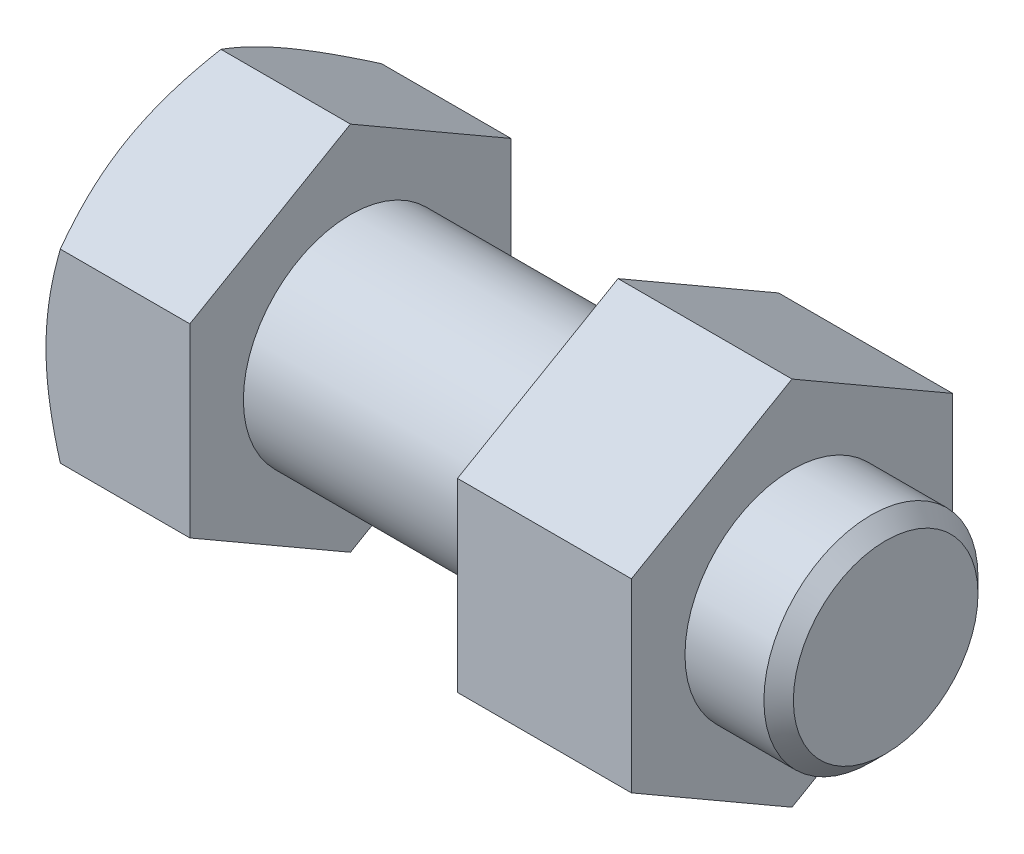
ISO-10303-21;
HEADER;
FILE_DESCRIPTION(('STEP AP214'),'2;1');
FILE_NAME('part.step','',(''),(''),'','','');
FILE_SCHEMA(('AUTOMOTIVE_DESIGN { 1 0 10303 214 1 1 1 1 }'));
ENDSEC;
DATA;
#1=APPLICATION_CONTEXT('core data for automotive mechanical design processes');
#2=APPLICATION_PROTOCOL_DEFINITION('international standard','automotive_design',2000,#1);
#3=PRODUCT_CONTEXT('',#1,'mechanical');
#4=PRODUCT('Part','Part','',(#3));
#5=PRODUCT_RELATED_PRODUCT_CATEGORY('part','',(#4));
#6=PRODUCT_DEFINITION_FORMATION('','',#4);
#7=PRODUCT_DEFINITION_CONTEXT('part definition',#1,'design');
#8=PRODUCT_DEFINITION('design','',#6,#7);
#9=PRODUCT_DEFINITION_SHAPE('','',#8);
#10=(LENGTH_UNIT() NAMED_UNIT(*) SI_UNIT(.MILLI.,.METRE.));
#11=(NAMED_UNIT(*) PLANE_ANGLE_UNIT() SI_UNIT($,.RADIAN.));
#12=(NAMED_UNIT(*) SI_UNIT($,.STERADIAN.) SOLID_ANGLE_UNIT());
#13=UNCERTAINTY_MEASURE_WITH_UNIT(LENGTH_MEASURE(1.E-05),#10,'distance_accuracy_value','');
#14=(GEOMETRIC_REPRESENTATION_CONTEXT(3) GLOBAL_UNCERTAINTY_ASSIGNED_CONTEXT((#13)) GLOBAL_UNIT_ASSIGNED_CONTEXT((#10,
#11,#12)) REPRESENTATION_CONTEXT('',''));
#15=CARTESIAN_POINT('',(0.,0.,0.));
#16=DIRECTION('',(0.,0.,1.));
#17=DIRECTION('',(1.,0.,0.));
#18=AXIS2_PLACEMENT_3D('',#15,#16,#17);
#19=CARTESIAN_POINT('',(0.,0.,0.));
#20=DIRECTION('',(-1.,0.,0.));
#21=DIRECTION('',(0.,0.,1.00000000000004));
#22=AXIS2_PLACEMENT_3D('',#19,#20,#21);
#23=CYLINDRICAL_SURFACE('',#22,8.);
#24=CARTESIAN_POINT('',(10.75,-3.33066907387547E-13,1.49880108324396E-12));
#25=DIRECTION('',(1.,0.,0.));
#26=DIRECTION('',(0.,0.,-1.00000000000004));
#27=AXIS2_PLACEMENT_3D('',#24,#25,#26);
#28=CIRCLE('',#27,8.);
#29=CARTESIAN_POINT('',(10.75,-5.39124300757976E-13,-7.99999999999882));
#30=VERTEX_POINT('',#29);
#31=EDGE_CURVE('E276',#30,#30,#28,.F.);
#32=ORIENTED_EDGE('',*,*,#31,.F.);
#33=EDGE_LOOP('',(#32));
#34=FACE_BOUND('',#33,.T.);
#35=CARTESIAN_POINT('',(30.7500000000001,-6.93889390390723E-13,2.13717932240343E-12));
#36=DIRECTION('',(1.,0.,0.));
#37=DIRECTION('',(0.,0.,-1.00000000000004));
#38=AXIS2_PLACEMENT_3D('',#35,#36,#37);
#39=CIRCLE('',#38,8.);
#40=CARTESIAN_POINT('',(30.7500000000001,-8.99946783761152E-13,-7.99999999999819));
#41=VERTEX_POINT('',#40);
#42=EDGE_CURVE('E11',#41,#41,#39,.T.);
#43=ORIENTED_EDGE('',*,*,#42,.F.);
#44=EDGE_LOOP('',(#43));
#45=FACE_BOUND('',#44,.T.);
#46=ADVANCED_FACE('F34',(#34,#45),#23,.T.);
#47=CARTESIAN_POINT('',(10.75,6.92820323027521,-11.9999999999988));
#48=DIRECTION('',(0.,-0.866025403784438,0.500000000000001));
#49=DIRECTION('',(0.,-0.500000000000034,-0.866025403784486));
#50=AXIS2_PLACEMENT_3D('',#47,#48,#49);
#51=PLANE('',#50);
#52=CARTESIAN_POINT('',(1.07186343722443,13.8565219306047,0.000200000002364975));
#53=CARTESIAN_POINT('',(0.983949632185894,13.7042251307134,-0.263585795240103));
#54=CARTESIAN_POINT('',(0.900025997556726,13.5513604901484,-0.52835511937974));
#55=CARTESIAN_POINT('',(0.741266218872873,13.2444053507122,-1.06001701652775));
#56=CARTESIAN_POINT('',(0.666433063673565,13.0903144663125,-1.3269102572912));
#57=CARTESIAN_POINT('',(0.457017539853894,12.6255589607761,-2.13189040597759));
#58=CARTESIAN_POINT('',(0.337903236722407,12.3130596590921,-2.67315507382412));
#59=CARTESIAN_POINT('',(0.198231061002743,11.8454187840145,-3.48313282915447));
#60=CARTESIAN_POINT('',(0.158443797040114,11.6916742921308,-3.74942610048088));
#61=CARTESIAN_POINT('',(0.0917233692164842,11.3834734611374,-4.28324559869649));
#62=CARTESIAN_POINT('',(0.0647904527668233,11.229017108384,-4.55077184921715));
#63=CARTESIAN_POINT('',(0.0244685919168984,10.919846895381,-5.08627036632515));
#64=CARTESIAN_POINT('',(0.0110635528835544,10.7651335610073,-5.35424172206845));
#65=CARTESIAN_POINT('',(-0.00191690624503581,10.4555635369285,-5.89043273227393));
#66=CARTESIAN_POINT('',(-0.00149275364417565,10.3007068518007,-6.15865237880818));
#67=CARTESIAN_POINT('',(0.0122200193365649,10.011202064883,-6.6600893787839));
#68=CARTESIAN_POINT('',(0.0238359825764981,9.8765333164982,-6.89334249317705));
#69=CARTESIAN_POINT('',(0.0573080088733852,9.60750555673675,-7.35931224172962));
#70=CARTESIAN_POINT('',(0.0791647962660929,9.47314656794506,-7.59202883677067));
#71=CARTESIAN_POINT('',(0.132737416541935,9.20481134519063,-8.05679907604184));
#72=CARTESIAN_POINT('',(0.164461392492234,9.07083551994057,-8.28885201236084));
#73=CARTESIAN_POINT('',(0.237211775669958,8.80351197901461,-8.75186996730376));
#74=CARTESIAN_POINT('',(0.27823881518264,8.67016430666039,-8.98283491089233));
#75=CARTESIAN_POINT('',(0.416311653281114,8.26537996384174,-9.68394195876266));
#76=CARTESIAN_POINT('',(0.527124888338661,7.99511549730912,-10.1520537462777));
#77=CARTESIAN_POINT('',(0.778625766937473,7.45861659251231,-11.0812971075907));
#78=CARTESIAN_POINT('',(0.919254342659189,7.19237528499079,-11.5424405792912));
#79=CARTESIAN_POINT('',(1.07186343722465,6.92808776022086,-12.0001999999988));
#80=B_SPLINE_CURVE_WITH_KNOTS('',3,(#52,#53,#54,#55,#56,#57,#58,#59,#60,#61,#62,#63,#64,#65,#66,
#67,#68,#69,#70,#71,#72,#73,#74,#75,#76,#77,#78,#79),.UNSPECIFIED.,.F.,.F.,(4,2,2,2,2,2,2,2,2,2,
2,2,2,4),(0.,0.951004872251349,1.90232158356473,3.80900466161553,4.73894551413768,
5.66890426477839,6.59775529890097,7.52657763277138,8.33514643820742,9.14377244252895,
9.953067557999,10.7624176939277,12.4167102786912,14.0677556316709),.UNSPECIFIED.);
#81=CARTESIAN_POINT('',(1.07179676972446,13.8564064605509,1.99840144432528E-12));
#82=VERTEX_POINT('',#81);
#83=CARTESIAN_POINT('',(-6.66133814775094E-12,10.3923048454128,-5.99999999999878));
#84=VERTEX_POINT('',#83);
#85=EDGE_CURVE('E51',#82,#84,#80,.T.);
#86=ORIENTED_EDGE('',*,*,#85,.F.);
#87=DIRECTION('',(-1.,0.,0.));
#88=VECTOR('',#87,1.);
#89=CARTESIAN_POINT('',(10.75,13.856406460551,1.16573417585641E-12));
#90=LINE('',#89,#88);
#91=CARTESIAN_POINT('',(10.75,13.856406460551,1.16573417585641E-12));
#92=VERTEX_POINT('',#91);
#93=EDGE_CURVE('E312',#92,#82,#90,.T.);
#94=ORIENTED_EDGE('',*,*,#93,.F.);
#95=DIRECTION('',(0.,0.500000000000034,0.866025403784486));
#96=VECTOR('',#95,1.);
#97=CARTESIAN_POINT('',(10.75,6.92820323027521,-11.9999999999988));
#98=LINE('',#97,#96);
#99=CARTESIAN_POINT('',(10.75,6.92820323027521,-11.9999999999988));
#100=VERTEX_POINT('',#99);
#101=EDGE_CURVE('E280',#100,#92,#98,.T.);
#102=ORIENTED_EDGE('',*,*,#101,.F.);
#103=DIRECTION('',(-1.,0.,0.));
#104=VECTOR('',#103,1.);
#105=CARTESIAN_POINT('',(10.75,6.92820323027521,-11.9999999999988));
#106=LINE('',#105,#104);
#107=CARTESIAN_POINT('',(1.07179676972469,6.92820323027482,-11.9999999999998));
#108=VERTEX_POINT('',#107);
#109=EDGE_CURVE('E297',#100,#108,#106,.T.);
#110=ORIENTED_EDGE('',*,*,#109,.T.);
#111=EDGE_CURVE('E228',#84,#108,#80,.T.);
#112=ORIENTED_EDGE('',*,*,#111,.F.);
#113=EDGE_LOOP('',(#86,#94,#102,#110,#112));
#114=FACE_BOUND('',#113,.T.);
#115=ADVANCED_FACE('F36',(#114),#51,.F.);
#116=CARTESIAN_POINT('',(10.75,13.856406460551,1.16573417585641E-12));
#117=DIRECTION('',(0.,-0.866025403784468,-0.500000000000042));
#118=DIRECTION('',(0.,0.499999999999991,-0.86602540378446));
#119=AXIS2_PLACEMENT_3D('',#116,#117,#118);
#120=PLANE('',#119);
#121=CARTESIAN_POINT('',(1.07186343722443,6.92808776022119,12.0002000000019));
#122=CARTESIAN_POINT('',(0.983949632186213,7.08038456011263,11.7364142047594));
#123=CARTESIAN_POINT('',(0.90002599755718,7.23324920067772,11.4716448806198));
#124=CARTESIAN_POINT('',(0.741266218873454,7.54020434011391,10.9399829834719));
#125=CARTESIAN_POINT('',(0.666433063674136,7.69429522451358,10.6730897427085));
#126=CARTESIAN_POINT('',(0.457017539854576,8.15905073004978,9.86810959402248));
#127=CARTESIAN_POINT('',(0.337903236723267,8.47155003173359,9.32684492617633));
#128=CARTESIAN_POINT('',(0.198231061003526,8.93919090681097,8.51686717084636));
#129=CARTESIAN_POINT('',(0.15844379704081,9.09293539869466,8.25057389951997));
#130=CARTESIAN_POINT('',(0.0917233692174084,9.40113622968807,7.71675440130446));
#131=CARTESIAN_POINT('',(0.06479045276806,9.55559258244141,7.44922815078389));
#132=CARTESIAN_POINT('',(0.024468591917226,9.86476279544439,6.91372963367589));
#133=CARTESIAN_POINT('',(0.0110635528826663,10.019476129818,6.64575827793252));
#134=CARTESIAN_POINT('',(-0.00191690624268495,10.329046153897,6.10956726772713));
#135=CARTESIAN_POINT('',(-0.00149275363736663,10.4839028390253,5.84134762119307));
#136=CARTESIAN_POINT('',(0.012220019342683,10.7734076259432,5.33991062121704));
#137=CARTESIAN_POINT('',(0.0238359825786375,10.9080763743277,5.10665750682347));
#138=CARTESIAN_POINT('',(0.0573080088726094,11.177104134089,4.64068775827056));
#139=CARTESIAN_POINT('',(0.0791647962663776,11.3114631228808,4.40797116322957));
#140=CARTESIAN_POINT('',(0.132737416542993,11.5797983456353,3.94320092395845));
#141=CARTESIAN_POINT('',(0.164461392493004,11.7137741708854,3.71114798763942));
#142=CARTESIAN_POINT('',(0.237211775670495,11.9810977118113,3.2481300326965));
#143=CARTESIAN_POINT('',(0.278238815183231,12.1144453841655,3.01716508910797));
#144=CARTESIAN_POINT('',(0.416311653281766,12.5192297269841,2.3160580412379));
#145=CARTESIAN_POINT('',(0.527124888339236,12.7894941935166,1.84794625372307));
#146=CARTESIAN_POINT('',(0.778625766937749,13.3259930983133,0.918702892410331));
#147=CARTESIAN_POINT('',(0.919254342659257,13.5922344058348,0.457559420709732));
#148=CARTESIAN_POINT('',(1.07186343722443,13.8565219306048,-0.000199999997868572));
#149=B_SPLINE_CURVE_WITH_KNOTS('',3,(#121,#122,#123,#124,#125,#126,#127,#128,#129,#130,#131,
#132,#133,#134,#135,#136,#137,#138,#139,#140,#141,#142,#143,#144,#145,#146,#147,#148),
.UNSPECIFIED.,.F.,.F.,(4,2,2,2,2,2,2,2,2,2,2,2,2,4),(0.,0.951004872251295,1.90232158356449,
3.80900466161401,4.73894551413611,5.66890426477659,6.59775529889922,7.52657763276993,
8.3351464382063,9.14377244252791,9.95306755799798,10.7624176939266,12.4167102786893,
14.067755631669),.UNSPECIFIED.);
#150=CARTESIAN_POINT('',(1.07179676972446,6.92820323027515,12.0000000000023));
#151=VERTEX_POINT('',#150);
#152=CARTESIAN_POINT('',(-6.66133814775094E-12,10.3923048454135,6.00000000000145));
#153=VERTEX_POINT('',#152);
#154=EDGE_CURVE('E59',#151,#153,#149,.T.);
#155=ORIENTED_EDGE('',*,*,#154,.F.);
#156=DIRECTION('',(-1.,0.,0.));
#157=VECTOR('',#156,1.);
#158=CARTESIAN_POINT('',(10.75,6.92820323027571,12.0000000000016));
#159=LINE('',#158,#157);
#160=CARTESIAN_POINT('',(10.75,6.92820323027571,12.0000000000016));
#161=VERTEX_POINT('',#160);
#162=EDGE_CURVE('E309',#161,#151,#159,.T.);
#163=ORIENTED_EDGE('',*,*,#162,.F.);
#164=DIRECTION('',(0.,-0.499999999999991,0.86602540378446));
#165=VECTOR('',#164,1.);
#166=CARTESIAN_POINT('',(10.75,13.856406460551,1.16573417585641E-12));
#167=LINE('',#166,#165);
#168=EDGE_CURVE('E287',#92,#161,#167,.T.);
#169=ORIENTED_EDGE('',*,*,#168,.F.);
#170=ORIENTED_EDGE('',*,*,#93,.T.);
#171=EDGE_CURVE('E225',#153,#82,#149,.T.);
#172=ORIENTED_EDGE('',*,*,#171,.F.);
#173=EDGE_LOOP('',(#155,#163,#169,#170,#172));
#174=FACE_BOUND('',#173,.T.);
#175=ADVANCED_FACE('F244',(#174),#120,.F.);
#176=CARTESIAN_POINT('',(10.75,6.92820323027571,12.0000000000016));
#177=DIRECTION('',(0.,0.,-1.00000000000004));
#178=DIRECTION('',(-1.,0.,0.));
#179=AXIS2_PLACEMENT_3D('',#176,#177,#178);
#180=PLANE('',#179);
#181=CARTESIAN_POINT('',(5.93796522499179,-18.7780422876816,12.0000000000014));
#182=CARTESIAN_POINT('',(5.81013580153232,-18.5152821742345,12.0000000000019));
#183=CARTESIAN_POINT('',(5.68293119845645,-18.2522182359301,12.0000000000022));
#184=CARTESIAN_POINT('',(5.42991281410132,-17.725419368102,12.0000000000023));
#185=CARTESIAN_POINT('',(5.30409904630147,-17.4616844321058,12.0000000000023));
#186=CARTESIAN_POINT('',(4.92892368290961,-16.6693101743885,12.0000000000022));
#187=CARTESIAN_POINT('',(4.68186469153085,-16.1395765656335,12.0000000000022));
#188=CARTESIAN_POINT('',(4.19405479953074,-15.073816919008,12.0000000000022));
#189=CARTESIAN_POINT('',(3.95334413341116,-14.5377724221019,12.0000000000022));
#190=CARTESIAN_POINT('',(3.4815471867471,-13.4614790602082,12.0000000000021));
#191=CARTESIAN_POINT('',(3.2504604626105,-12.921230390367,12.0000000000021));
#192=CARTESIAN_POINT('',(2.79294900667216,-11.8175688689819,12.0000000000021));
#193=CARTESIAN_POINT('',(2.56693655895591,-11.2539842320577,12.0000000000021));
#194=CARTESIAN_POINT('',(2.13161283273247,-10.1202797331246,12.000000000002));
#195=CARTESIAN_POINT('',(1.92230340506646,-9.55015915485895,12.000000000002));
#196=CARTESIAN_POINT('',(1.52576124918653,-8.40350794466324,12.0000000000021));
#197=CARTESIAN_POINT('',(1.33848523718379,-7.82699240007857,12.0000000000022));
#198=CARTESIAN_POINT('',(0.991896700180565,-6.66563869600154,12.0000000000017));
#199=CARTESIAN_POINT('',(0.832575542891503,-6.08080316618944,12.0000000000011));
#200=CARTESIAN_POINT('',(0.620681197025682,-5.19882791551987,12.0000000000015));
#201=CARTESIAN_POINT('',(0.554713150856077,-4.90488790342152,12.0000000000018));
#202=CARTESIAN_POINT('',(0.432574422997273,-4.31496880701143,12.000000000002));
#203=CARTESIAN_POINT('',(0.376403548450563,-4.01898976295733,12.0000000000019));
#204=CARTESIAN_POINT('',(0.274840044166114,-3.42518449183541,12.0000000000019));
#205=CARTESIAN_POINT('',(0.229447213468121,-3.12735829931457,12.0000000000019));
#206=CARTESIAN_POINT('',(0.150338666865306,-2.53016033534851,12.0000000000019));
#207=CARTESIAN_POINT('',(0.116622484245904,-2.23078862616299,12.0000000000019));
#208=CARTESIAN_POINT('',(0.0619693201293942,-1.63489952034488,12.0000000000018));
#209=CARTESIAN_POINT('',(0.0408679219523276,-1.338397297054,12.0000000000018));
#210=CARTESIAN_POINT('',(0.0112310519032364,-0.744766224338409,12.0000000000018));
#211=CARTESIAN_POINT('',(0.00269536679761506,-0.447637385632712,12.0000000000018));
#212=CARTESIAN_POINT('',(-0.00160621157092758,0.146715096942591,12.0000000000018));
#213=CARTESIAN_POINT('',(0.00262788821597885,0.44393874076051,12.0000000000017));
#214=CARTESIAN_POINT('',(0.0237602868321036,1.03793867900035,12.0000000000018));
#215=CARTESIAN_POINT('',(0.0406591751134937,1.33471495195624,12.000000000002));
#216=CARTESIAN_POINT('',(0.0957363037223829,2.04293812544864,12.0000000000021));
#217=CARTESIAN_POINT('',(0.139644388870034,2.45394931182449,12.0000000000018));
#218=CARTESIAN_POINT('',(0.249393763137116,3.27301119833334,12.0000000000016));
#219=CARTESIAN_POINT('',(0.315237895548316,3.68106150767601,12.0000000000017));
#220=CARTESIAN_POINT('',(0.542190666924962,4.90025554060059,12.0000000000017));
#221=CARTESIAN_POINT('',(0.732681274216919,5.7060072623867,12.0000000000017));
#222=CARTESIAN_POINT('',(1.06415793334703,6.91101760118575,12.0000000000016));
#223=CARTESIAN_POINT('',(1.18384338751881,7.31649624625208,12.0000000000016));
#224=CARTESIAN_POINT('',(1.4359355147649,8.12351840181133,12.0000000000016));
#225=CARTESIAN_POINT('',(1.56834227451046,8.52506188547313,12.0000000000016));
#226=CARTESIAN_POINT('',(1.84372865812832,9.32433402651654,12.0000000000015));
#227=CARTESIAN_POINT('',(1.98670500372001,9.72206382387882,12.0000000000014));
#228=CARTESIAN_POINT('',(2.28151949374415,10.5142091061849,12.0000000000017));
#229=CARTESIAN_POINT('',(2.43335751674023,10.9086246364612,12.0000000000021));
#230=CARTESIAN_POINT('',(2.81137815071337,11.8636440545744,12.0000000000022));
#231=CARTESIAN_POINT('',(3.04143185567914,12.4227131308578,12.0000000000017));
#232=CARTESIAN_POINT('',(3.51333410611275,13.5358669332651,12.0000000000013));
#233=CARTESIAN_POINT('',(3.75518348678347,14.089951303143,12.0000000000014));
#234=CARTESIAN_POINT('',(4.24823475653197,15.1941025186566,12.0000000000015));
#235=CARTESIAN_POINT('',(4.4994390404373,15.7441682918314,12.0000000000014));
#236=CARTESIAN_POINT('',(5.00924552887412,16.8408349536018,12.0000000000014));
#237=CARTESIAN_POINT('',(5.26784754956335,17.3874359278898,12.0000000000013));
#238=CARTESIAN_POINT('',(5.79133879928515,18.4784293923,12.0000000000013));
#239=CARTESIAN_POINT('',(6.05623527465254,19.0228183989981,12.0000000000013));
#240=CARTESIAN_POINT('',(6.59090796254109,20.1091945794082,12.0000000000013));
#241=CARTESIAN_POINT('',(6.86068419945776,20.6511817410958,12.0000000000013));
#242=CARTESIAN_POINT('',(7.40421496208694,21.7330545936327,12.0000000000012));
#243=CARTESIAN_POINT('',(7.67796889125728,22.272940584511,12.0000000000012));
#244=CARTESIAN_POINT('',(8.22882461462111,23.3510028742048,12.0000000000012));
#245=CARTESIAN_POINT('',(8.50592642242854,23.8891791660567,12.0000000000012));
#246=CARTESIAN_POINT('',(9.2922659614615,25.4066579940567,12.0000000000011));
#247=CARTESIAN_POINT('',(9.80475659623558,26.3842748096138,12.0000000000011));
#248=CARTESIAN_POINT('',(10.8366490575026,28.3358962609435,12.0000000000011));
#249=CARTESIAN_POINT('',(11.3560511647274,29.3099007479223,12.000000000001));
#250=CARTESIAN_POINT('',(12.3986980712298,31.2524398572293,12.000000000001));
#251=CARTESIAN_POINT('',(12.9219285874184,32.2209821512088,12.000000000001));
#252=CARTESIAN_POINT('',(13.7098172611683,33.6721037842398,12.0000000000009));
#253=CARTESIAN_POINT('',(13.9729461083088,34.1555146940214,12.0000000000008));
#254=CARTESIAN_POINT('',(14.5001155834578,35.1218381868037,12.000000000001));
#255=CARTESIAN_POINT('',(14.7641562100753,35.6047507705632,12.0000000000013));
#256=CARTESIAN_POINT('',(15.0285993289474,36.087442911269,12.0000000000019));
#257=B_SPLINE_CURVE_WITH_KNOTS('',3,(#181,#182,#183,#184,#185,#186,#187,#188,#189,#190,#191,
#192,#193,#194,#195,#196,#197,#198,#199,#200,#201,#202,#203,#204,#205,#206,#207,#208,#209,#210,
#211,#212,#213,#214,#215,#216,#217,#218,#219,#220,#221,#222,#223,#224,#225,#226,#227,#228,#229,
#230,#231,#232,#233,#234,#235,#236,#237,#238,#239,#240,#241,#242,#243,#244,#245,#246,#247,#248,
#249,#250,#251,#252,#253,#254,#255,#256),.UNSPECIFIED.,.F.,.F.,(4,2,2,2,2,2,2,2,2,2,2,2,2,2,2,2,
2,2,2,2,2,2,2,2,2,2,2,2,2,2,2,2,2,2,2,2,2,4),(0.,0.876610778943389,1.75323004620519,
3.50671945197801,5.26947518067916,7.0321495693306,8.85359042595699,10.6752328347615,
12.4932347351837,14.3106742559307,15.2142921518808,16.1178922580872,17.0214755150422,
17.9250226516859,18.816520871687,19.7080039632538,20.599486569616,21.4910106704726,
22.7303633484052,23.9698767304573,26.4502079763427,27.7184187234138,28.9866381115163,
30.2544657836993,31.5222760862277,33.3357454112637,35.1493433274816,36.9634087547281,
38.7774291394606,40.5936500751824,42.4098800933003,44.2258404831105,46.0418082599001,
49.3531754129826,52.6646774810082,55.9671781132064,57.6183303465535,59.2694800621134),.UNSPECIFIED.);
#258=CARTESIAN_POINT('',(1.07179676972446,-6.92820323027576,12.0000000000024));
#259=VERTEX_POINT('',#258);
#260=CARTESIAN_POINT('',(0.,-2.4980018054066E-13,12.0000000000018));
#261=VERTEX_POINT('',#260);
#262=EDGE_CURVE('E283',#259,#261,#257,.T.);
#263=ORIENTED_EDGE('',*,*,#262,.F.);
#264=DIRECTION('',(-1.,0.,0.));
#265=VECTOR('',#264,1.);
#266=CARTESIAN_POINT('',(10.7499999999998,-6.92820323027568,12.0000000000011));
#267=LINE('',#266,#265);
#268=CARTESIAN_POINT('',(10.7499999999998,-6.92820323027568,12.0000000000011));
#269=VERTEX_POINT('',#268);
#270=EDGE_CURVE('E306',#269,#259,#267,.T.);
#271=ORIENTED_EDGE('',*,*,#270,.F.);
#272=DIRECTION('',(0.,-1.00000000000002,0.));
#273=VECTOR('',#272,1.);
#274=CARTESIAN_POINT('',(10.75,6.92820323027571,12.0000000000016));
#275=LINE('',#274,#273);
#276=EDGE_CURVE('E289',#161,#269,#275,.T.);
#277=ORIENTED_EDGE('',*,*,#276,.F.);
#278=ORIENTED_EDGE('',*,*,#162,.T.);
#279=EDGE_CURVE('E238',#261,#151,#257,.T.);
#280=ORIENTED_EDGE('',*,*,#279,.F.);
#281=EDGE_LOOP('',(#263,#271,#277,#278,#280));
#282=FACE_BOUND('',#281,.T.);
#283=ADVANCED_FACE('F215',(#282),#180,.F.);
#284=CARTESIAN_POINT('',(10.75,-13.8564064605514,7.49400541621981E-13));
#285=DIRECTION('',(0.,0.866025403784438,-0.500000000000001));
#286=DIRECTION('',(0.,0.500000000000034,0.866025403784486));
#287=AXIS2_PLACEMENT_3D('',#284,#285,#286);
#288=PLANE('',#287);
#289=CARTESIAN_POINT('',(1.07186343722443,-13.8565219306057,-0.000199999998673484));
#290=CARTESIAN_POINT('',(0.983949632185957,-13.7042251307138,0.263585795243379));
#291=CARTESIAN_POINT('',(0.900025997556836,-13.5513604901486,0.528355119382815));
#292=CARTESIAN_POINT('',(0.741266218873085,-13.2444053507123,1.06001701653058));
#293=CARTESIAN_POINT('',(0.66643306367383,-13.0903144663127,1.32691025729398));
#294=CARTESIAN_POINT('',(0.457017539854416,-12.6255589607766,2.13189040597993));
#295=CARTESIAN_POINT('',(0.337903236723144,-12.3130596590928,2.673155073826));
#296=CARTESIAN_POINT('',(0.198231061003487,-11.8454187840155,3.48313282915586));
#297=CARTESIAN_POINT('',(0.158443797040805,-11.6916742921318,3.74942610048222));
#298=CARTESIAN_POINT('',(0.0917233692174498,-11.3834734611385,4.28324559869768));
#299=CARTESIAN_POINT('',(0.0647904527681161,-11.2290171083852,4.55077184921823));
#300=CARTESIAN_POINT('',(0.0244685919173672,-10.9198468953822,5.08627036632613));
#301=CARTESIAN_POINT('',(0.0110635528828777,-10.7651335610086,5.35424172206943));
#302=CARTESIAN_POINT('',(-0.00191690624255956,-10.4555635369298,5.89043273227486));
#303=CARTESIAN_POINT('',(-0.00149275363739748,-10.3007068518018,6.15865237880905));
#304=CARTESIAN_POINT('',(0.0122200193427125,-10.0112020648839,6.66008937878508));
#305=CARTESIAN_POINT('',(0.0238359825788427,-9.8765333164991,6.89334249317856));
#306=CARTESIAN_POINT('',(0.057308008872972,-9.60750555673752,7.3593122417315));
#307=CARTESIAN_POINT('',(0.0791647962667222,-9.47314656794577,7.59202883677259));
#308=CARTESIAN_POINT('',(0.132737416543363,-9.20481134519125,8.05679907604388));
#309=CARTESIAN_POINT('',(0.164461392493416,-9.07083551994115,8.28885201236296));
#310=CARTESIAN_POINT('',(0.237211775670975,-8.80351197901513,8.75186996730601));
#311=CARTESIAN_POINT('',(0.278238815183735,-8.67016430666089,8.98283491089463));
#312=CARTESIAN_POINT('',(0.416311653282397,-8.26537996384224,9.68394195876488));
#313=CARTESIAN_POINT('',(0.527124888340024,-7.99511549730959,10.1520537462798));
#314=CARTESIAN_POINT('',(0.778625766938513,-7.45861659251295,11.0812971075929));
#315=CARTESIAN_POINT('',(0.919254342659841,-7.19237528499164,11.5424405792939));
#316=CARTESIAN_POINT('',(1.07186343722443,-6.9280877602223,12.0002000000022));
#317=B_SPLINE_CURVE_WITH_KNOTS('',3,(#289,#290,#291,#292,#293,#294,#295,#296,#297,#298,#299,
#300,#301,#302,#303,#304,#305,#306,#307,#308,#309,#310,#311,#312,#313,#314,#315,#316),
.UNSPECIFIED.,.F.,.F.,(4,2,2,2,2,2,2,2,2,2,2,2,2,4),(0.,0.951004872251155,1.90232158356421,
3.80900466161347,4.73894551413545,5.66890426477581,6.59775529889831,7.52657763276887,
8.33514643820546,9.1437724425273,9.9530675579976,10.7624176939265,12.4167102786896,
14.0677556316698),.UNSPECIFIED.);
#318=CARTESIAN_POINT('',(1.07179676972446,-13.8564064605518,1.22124532708767E-12));
#319=VERTEX_POINT('',#318);
#320=CARTESIAN_POINT('',(0.,-10.3923048454135,6.00000000000095));
#321=VERTEX_POINT('',#320);
#322=EDGE_CURVE('E219',#319,#321,#317,.T.);
#323=ORIENTED_EDGE('',*,*,#322,.F.);
#324=DIRECTION('',(-1.,0.,0.));
#325=VECTOR('',#324,1.);
#326=CARTESIAN_POINT('',(10.75,-13.8564064605514,7.49400541621981E-13));
#327=LINE('',#326,#325);
#328=CARTESIAN_POINT('',(10.75,-13.8564064605514,7.49400541621981E-13));
#329=VERTEX_POINT('',#328);
#330=EDGE_CURVE('E303',#329,#319,#327,.T.);
#331=ORIENTED_EDGE('',*,*,#330,.F.);
#332=DIRECTION('',(0.,-0.500000000000034,-0.866025403784486));
#333=VECTOR('',#332,1.);
#334=CARTESIAN_POINT('',(10.75,-13.8564064605514,7.49400541621981E-13));
#335=LINE('',#334,#333);
#336=EDGE_CURVE('E291',#269,#329,#335,.T.);
#337=ORIENTED_EDGE('',*,*,#336,.F.);
#338=ORIENTED_EDGE('',*,*,#270,.T.);
#339=EDGE_CURVE('E227',#321,#259,#317,.T.);
#340=ORIENTED_EDGE('',*,*,#339,.F.);
#341=EDGE_LOOP('',(#323,#331,#337,#338,#340));
#342=FACE_BOUND('',#341,.T.);
#343=ADVANCED_FACE('F210',(#342),#288,.F.);
#344=CARTESIAN_POINT('',(10.7499999999934,-6.92820323027599,-11.9999999999998));
#345=DIRECTION('',(0.,0.866025403784469,0.500000000000042));
#346=DIRECTION('',(0.,-0.499999999999992,0.866025403784462));
#347=AXIS2_PLACEMENT_3D('',#344,#345,#346);
#348=PLANE('',#347);
#349=CARTESIAN_POINT('',(1.07186343721799,-6.92808776022258,-12.0001999999993));
#350=CARTESIAN_POINT('',(0.983949632183164,-7.08038456011449,-11.7364142047563));
#351=CARTESIAN_POINT('',(0.900025997555614,-7.23324920067973,-11.4716448806165));
#352=CARTESIAN_POINT('',(0.741266218873101,-7.54020434011593,-10.9399829834685));
#353=CARTESIAN_POINT('',(0.666433063673511,-7.69429522451548,-10.6730897427053));
#354=CARTESIAN_POINT('',(0.457017539853614,-8.1590507300514,-9.86810959401982));
#355=CARTESIAN_POINT('',(0.337903236722731,-8.47155003173514,-9.3268449261738));
#356=CARTESIAN_POINT('',(0.19823106100324,-8.93919090681239,-8.51686717084408));
#357=CARTESIAN_POINT('',(0.158443797040544,-9.09293539869604,-8.25057389951774));
#358=CARTESIAN_POINT('',(0.0917233692172156,-9.40113622968938,-7.71675440130236));
#359=CARTESIAN_POINT('',(0.0647904527679222,-9.5555925824427,-7.44922815078186));
#360=CARTESIAN_POINT('',(0.0244685919171525,-9.86476279544558,-6.91372963367396));
#361=CARTESIAN_POINT('',(0.0110635528826016,-10.0194761298191,-6.64575827793063));
#362=CARTESIAN_POINT('',(-0.0019169062426105,-10.3290461538982,-6.10956726772546));
#363=CARTESIAN_POINT('',(-0.00149275363716175,-10.4839028390266,-5.84134762119156));
#364=CARTESIAN_POINT('',(0.0122200193429239,-10.7734076259444,-5.3399106212155));
#365=CARTESIAN_POINT('',(0.0238359825788179,-10.9080763743289,-5.10665750682177));
#366=CARTESIAN_POINT('',(0.0573080088727892,-11.1771041340902,-4.64068775826863));
#367=CARTESIAN_POINT('',(0.0791647962666172,-11.311463122882,-4.40797116322759));
#368=CARTESIAN_POINT('',(0.13273741654333,-11.5797983456367,-3.94320092395632));
#369=CARTESIAN_POINT('',(0.164461392493378,-11.7137741708868,-3.7111479876372));
#370=CARTESIAN_POINT('',(0.23721177567095,-11.9810977118128,-3.2481300326941));
#371=CARTESIAN_POINT('',(0.278238815183729,-12.1144453841671,-3.01716508910548));
#372=CARTESIAN_POINT('',(0.416311653282433,-12.5192297269857,-2.31605804123526));
#373=CARTESIAN_POINT('',(0.527124888340074,-12.7894941935184,-1.84794625372039));
#374=CARTESIAN_POINT('',(0.778625766938564,-13.325993098315,-0.918702892407281));
#375=CARTESIAN_POINT('',(0.919254342659876,-13.5922344058362,-0.457559420706336));
#376=CARTESIAN_POINT('',(1.07186343722443,-13.8565219306055,0.000200000002004153));
#377=B_SPLINE_CURVE_WITH_KNOTS('',3,(#349,#350,#351,#352,#353,#354,#355,#356,#357,#358,#359,
#360,#361,#362,#363,#364,#365,#366,#367,#368,#369,#370,#371,#372,#373,#374,#375,#376),
.UNSPECIFIED.,.F.,.F.,(4,2,2,2,2,2,2,2,2,2,2,2,2,4),(0.,0.95100487225076,1.9023215835635,
3.80900466161225,4.73894551413412,5.6689042647744,6.59775529889679,7.52657763276725,
8.33514643820391,9.14377244252579,9.95306755799617,10.7624176939251,12.4167102786882,
14.0677556316682),.UNSPECIFIED.);
#378=CARTESIAN_POINT('',(1.0717967697178,-6.92820323027649,-11.9999999999993));
#379=VERTEX_POINT('',#378);
#380=CARTESIAN_POINT('',(0.,-10.3923048454141,-5.99999999999939));
#381=VERTEX_POINT('',#380);
#382=EDGE_CURVE('E187',#379,#381,#377,.T.);
#383=ORIENTED_EDGE('',*,*,#382,.F.);
#384=DIRECTION('',(-1.,0.,0.));
#385=VECTOR('',#384,1.);
#386=CARTESIAN_POINT('',(10.7499999999934,-6.92820323027599,-11.9999999999998));
#387=LINE('',#386,#385);
#388=CARTESIAN_POINT('',(10.7499999999934,-6.92820323027599,-11.9999999999998));
#389=VERTEX_POINT('',#388);
#390=EDGE_CURVE('E300',#389,#379,#387,.T.);
#391=ORIENTED_EDGE('',*,*,#390,.F.);
#392=DIRECTION('',(0.,0.499999999999991,-0.86602540378446));
#393=VECTOR('',#392,1.);
#394=CARTESIAN_POINT('',(10.7499999999934,-6.92820323027599,-11.9999999999998));
#395=LINE('',#394,#393);
#396=EDGE_CURVE('E293',#329,#389,#395,.T.);
#397=ORIENTED_EDGE('',*,*,#396,.F.);
#398=ORIENTED_EDGE('',*,*,#330,.T.);
#399=EDGE_CURVE('E226',#381,#319,#377,.T.);
#400=ORIENTED_EDGE('',*,*,#399,.F.);
#401=EDGE_LOOP('',(#383,#391,#397,#398,#400));
#402=FACE_BOUND('',#401,.T.);
#403=ADVANCED_FACE('F203',(#402),#348,.F.);
#404=CARTESIAN_POINT('',(10.75,6.92820323027521,-11.9999999999988));
#405=DIRECTION('',(0.,0.,1.00000000000004));
#406=DIRECTION('',(0.,-1.00000000000002,0.));
#407=AXIS2_PLACEMENT_3D('',#404,#405,#406);
#408=PLANE('',#407);
#409=CARTESIAN_POINT('',(5.9379652268805,-18.7780422915645,-12.));
#410=CARTESIAN_POINT('',(5.8101358033811,-18.5152821780524,-11.9999999999989));
#411=CARTESIAN_POINT('',(5.68293120026558,-18.2522182396827,-11.9999999999984));
#412=CARTESIAN_POINT('',(5.4299128158315,-17.7254193717239,-11.9999999999981));
#413=CARTESIAN_POINT('',(5.30409904799234,-17.4616844356622,-11.9999999999982));
#414=CARTESIAN_POINT('',(4.92892368448257,-16.6693101777485,-11.9999999999984));
#415=CARTESIAN_POINT('',(4.68186469302528,-16.1395765688622,-11.9999999999983));
#416=CARTESIAN_POINT('',(4.19405480086809,-15.0738169219723,-11.9999999999983));
#417=CARTESIAN_POINT('',(3.95334413466996,-14.5377724249329,-11.9999999999983));
#418=CARTESIAN_POINT('',(3.48154718785007,-13.4614790627716,-11.9999999999984));
#419=CARTESIAN_POINT('',(3.25046046363619,-12.9212303927962,-11.9999999999984));
#420=CARTESIAN_POINT('',(2.79294900754128,-11.8175688711325,-11.9999999999984));
#421=CARTESIAN_POINT('',(2.56693655974593,-11.2539842340638,-11.9999999999984));
#422=CARTESIAN_POINT('',(2.13161283336807,-10.1202797348394,-11.9999999999985));
#423=CARTESIAN_POINT('',(1.92230340562674,-9.55015915642699,-11.9999999999985));
#424=CARTESIAN_POINT('',(1.52576124960496,-8.4035079459347,-11.9999999999984));
#425=CARTESIAN_POINT('',(1.33848523753565,-7.82699240120025,-11.9999999999982));
#426=CARTESIAN_POINT('',(0.99189670040461,-6.66563869682107,-11.9999999999988));
#427=CARTESIAN_POINT('',(0.832575543054296,-6.08080316685661,-11.9999999999998));
#428=CARTESIAN_POINT('',(0.620681197109944,-5.19882791591565,-11.9999999999992));
#429=CARTESIAN_POINT('',(0.554713150913036,-4.90488790370093,-11.9999999999987));
#430=CARTESIAN_POINT('',(0.432574423004014,-4.31496880705714,-11.9999999999984));
#431=CARTESIAN_POINT('',(0.376403548434389,-4.01898976288571,-11.9999999999985));
#432=CARTESIAN_POINT('',(0.27484004411375,-3.42518449152764,-11.9999999999986));
#433=CARTESIAN_POINT('',(0.229447213402477,-3.12735829888798,-11.9999999999986));
#434=CARTESIAN_POINT('',(0.150338666782655,-2.53016033468331,-11.9999999999986));
#435=CARTESIAN_POINT('',(0.116622484159527,-2.230788625378,-11.9999999999986));
#436=CARTESIAN_POINT('',(0.0619693200461888,-1.63489951932274,-11.9999999999986));
#437=CARTESIAN_POINT('',(0.0408679218758271,-1.33839729591453,-11.9999999999986));
#438=CARTESIAN_POINT('',(0.0112310518506048,-0.744766222964499,-11.9999999999987));
#439=CARTESIAN_POINT('',(0.00269536676214726,-0.447637384141706,-11.9999999999987));
#440=CARTESIAN_POINT('',(-0.00160621156234633,0.146715098666931,-11.9999999999986));
#441=CARTESIAN_POINT('',(0.0026278882514469,0.443938742601089,-11.9999999999985));
#442=CARTESIAN_POINT('',(0.0237602869322737,1.03793868107182,-11.9999999999989));
#443=CARTESIAN_POINT('',(0.0406591752514811,1.33471495414236,-11.9999999999993));
#444=CARTESIAN_POINT('',(0.0957363039509735,2.04293812781214,-11.9999999999995));
#445=CARTESIAN_POINT('',(0.139644389148914,2.45394931425027,-11.999999999999));
#446=CARTESIAN_POINT('',(0.24939376352132,3.27301120088066,-11.9999999999985));
#447=CARTESIAN_POINT('',(0.315237895987553,3.68106151028259,-11.9999999999987));
#448=CARTESIAN_POINT('',(0.542190667529895,4.90025554338176,-11.9999999999989));
#449=CARTESIAN_POINT('',(0.732681274933038,5.70600726527975,-11.9999999999988));
#450=CARTESIAN_POINT('',(1.0641579342275,6.911017604246,-11.9999999999988));
#451=CARTESIAN_POINT('',(1.18384338845445,7.31649624936916,-11.9999999999988));
#452=CARTESIAN_POINT('',(1.43593551580926,8.12351840504139,-11.9999999999989));
#453=CARTESIAN_POINT('',(1.56834227560835,8.52506188875934,-11.9999999999989));
#454=CARTESIAN_POINT('',(1.84372865933107,9.32433402991479,-11.9999999999989));
#455=CARTESIAN_POINT('',(1.98670500497409,9.72206382733297,-11.9999999999989));
#456=CARTESIAN_POINT('',(2.28151949510026,10.5142091097504,-11.999999999999));
#457=CARTESIAN_POINT('',(2.43335751814702,10.9086246400822,-11.999999999999));
#458=CARTESIAN_POINT('',(2.81137815220046,11.863644058232,-11.9999999999991));
#459=CARTESIAN_POINT('',(3.04143185719155,12.4227131344981,-11.999999999999));
#460=CARTESIAN_POINT('',(3.51333410767084,13.5358669368723,-11.999999999999));
#461=CARTESIAN_POINT('',(3.7551834883619,14.0899513067343,-11.999999999999));
#462=CARTESIAN_POINT('',(4.24823475814576,15.1941025222179,-11.9999999999991));
#463=CARTESIAN_POINT('',(4.49943904206608,15.7441682953787,-11.9999999999991));
#464=CARTESIAN_POINT('',(5.00924553052933,16.8408349571223,-11.9999999999991));
#465=CARTESIAN_POINT('',(5.26784755122999,17.3874359313976,-11.9999999999991));
#466=CARTESIAN_POINT('',(5.79133880097153,18.4784293957831,-11.9999999999991));
#467=CARTESIAN_POINT('',(6.05623527634722,19.022818402469,-11.9999999999991));
#468=CARTESIAN_POINT('',(6.59090796425018,20.1091945828559,-11.9999999999992));
#469=CARTESIAN_POINT('',(6.86068420117298,20.6511817445323,-11.9999999999992));
#470=CARTESIAN_POINT('',(7.40421496381274,21.7330545970478,-11.9999999999992));
#471=CARTESIAN_POINT('',(7.67796889298755,22.2729405879157,-11.9999999999992));
#472=CARTESIAN_POINT('',(8.22882461635899,23.3510028775896,-11.9999999999992));
#473=CARTESIAN_POINT('',(8.50592642416956,23.8891791694319,-11.9999999999993));
#474=CARTESIAN_POINT('',(9.29226596321713,25.4066579974193,-11.9999999999993));
#475=CARTESIAN_POINT('',(9.8047565980016,26.384274812974,-11.9999999999993));
#476=CARTESIAN_POINT('',(10.8366490592872,28.3358962643001,-11.9999999999994));
#477=CARTESIAN_POINT('',(11.3560511665201,29.3099007512776,-11.9999999999994));
#478=CARTESIAN_POINT('',(12.3986980730386,31.2524398605853,-11.9999999999994));
#479=CARTESIAN_POINT('',(12.9219285892352,32.2209821545669,-11.9999999999994));
#480=CARTESIAN_POINT('',(13.7098172629962,33.6721037876014,-11.9999999999995));
#481=CARTESIAN_POINT('',(13.9729461101403,34.1555146973842,-11.9999999999995));
#482=CARTESIAN_POINT('',(14.5001155852963,35.1218381901692,-11.9999999999995));
#483=CARTESIAN_POINT('',(14.7641562119172,35.60475077393,-11.9999999999994));
#484=CARTESIAN_POINT('',(15.0285993307926,36.0874429146372,-11.9999999999992));
#485=B_SPLINE_CURVE_WITH_KNOTS('',3,(#409,#410,#411,#412,#413,#414,#415,#416,#417,#418,#419,
#420,#421,#422,#423,#424,#425,#426,#427,#428,#429,#430,#431,#432,#433,#434,#435,#436,#437,#438,
#439,#440,#441,#442,#443,#444,#445,#446,#447,#448,#449,#450,#451,#452,#453,#454,#455,#456,#457,
#458,#459,#460,#461,#462,#463,#464,#465,#466,#467,#468,#469,#470,#471,#472,#473,#474,#475,#476,
#477,#478,#479,#480,#481,#482,#483,#484),.UNSPECIFIED.,.F.,.F.,(4,2,2,2,2,2,2,2,2,2,2,2,2,2,2,2,
2,2,2,2,2,2,2,2,2,2,2,2,2,2,2,2,2,2,2,2,2,4),(0.,0.876610779171391,1.75323004666119,
3.50671945289018,5.26947518205277,7.03214957116554,8.8535904282826,10.6752328375782,
12.4932347384894,14.3106742597248,15.2142921560333,16.1178922625982,17.0214755199113,
17.9250226569131,18.8165208772635,19.7080039691797,20.5994865758914,21.4910106770975,
22.7303633552319,23.9698767374857,26.4502079837753,27.7184187310567,28.9866381193696,
30.2544657917626,31.522276094501,33.335745419518,35.1493433357169,36.9634087629436,
38.7774291476565,40.5936500833565,42.4098801014526,44.2258404912414,46.0418082680096,
49.3531754211003,52.6646774891339,55.9671781213488,57.6183303547044,59.2694800702728),.UNSPECIFIED.);
#486=CARTESIAN_POINT('',(0.,0.,-12.0000000000001));
#487=VERTEX_POINT('',#486);
#488=EDGE_CURVE('E186',#108,#487,#485,.F.);
#489=ORIENTED_EDGE('',*,*,#488,.F.);
#490=ORIENTED_EDGE('',*,*,#109,.F.);
#491=DIRECTION('',(0.,1.00000000000002,0.));
#492=VECTOR('',#491,1.);
#493=CARTESIAN_POINT('',(10.75,6.92820323027521,-11.9999999999988));
#494=LINE('',#493,#492);
#495=EDGE_CURVE('E295',#389,#100,#494,.T.);
#496=ORIENTED_EDGE('',*,*,#495,.F.);
#497=ORIENTED_EDGE('',*,*,#390,.T.);
#498=EDGE_CURVE('E178',#487,#379,#485,.F.);
#499=ORIENTED_EDGE('',*,*,#498,.F.);
#500=EDGE_LOOP('',(#489,#490,#496,#497,#499));
#501=FACE_BOUND('',#500,.T.);
#502=ADVANCED_FACE('F198',(#501),#408,.F.);
#503=CARTESIAN_POINT('',(10.75,13.856406460551,1.16573417585641E-12));
#504=DIRECTION('',(1.,0.,0.));
#505=DIRECTION('',(0.,0.,-1.00000000000004));
#506=AXIS2_PLACEMENT_3D('',#503,#504,#505);
#507=PLANE('',#506);
#508=ORIENTED_EDGE('',*,*,#31,.T.);
#509=EDGE_LOOP('',(#508));
#510=FACE_BOUND('',#509,.T.);
#511=ORIENTED_EDGE('',*,*,#101,.T.);
#512=ORIENTED_EDGE('',*,*,#168,.T.);
#513=ORIENTED_EDGE('',*,*,#276,.T.);
#514=ORIENTED_EDGE('',*,*,#336,.T.);
#515=ORIENTED_EDGE('',*,*,#396,.T.);
#516=ORIENTED_EDGE('',*,*,#495,.T.);
#517=EDGE_LOOP('',(#511,#512,#513,#514,#515,#516));
#518=FACE_BOUND('',#517,.T.);
#519=ADVANCED_FACE('F202',(#510,#518),#507,.T.);
#520=CARTESIAN_POINT('',(0.,0.,0.));
#521=DIRECTION('',(1.,0.,0.));
#522=DIRECTION('',(0.,0.,-1.00000000000004));
#523=AXIS2_PLACEMENT_3D('',#520,#521,#522);
#524=CONICAL_SURFACE('',#523,12.,1.0471975511966);
#525=ORIENTED_EDGE('',*,*,#382,.T.);
#526=CARTESIAN_POINT('',(0.,0.,0.));
#527=DIRECTION('',(1.,0.,0.));
#528=DIRECTION('',(0.,0.,-1.00000000000004));
#529=AXIS2_PLACEMENT_3D('',#526,#527,#528);
#530=CIRCLE('',#529,12.);
#531=EDGE_CURVE('E315',#381,#487,#530,.T.);
#532=ORIENTED_EDGE('',*,*,#531,.T.);
#533=ORIENTED_EDGE('',*,*,#498,.T.);
#534=EDGE_LOOP('',(#525,#532,#533));
#535=FACE_BOUND('',#534,.T.);
#536=ADVANCED_FACE('F355',(#535),#524,.T.);
#537=ORIENTED_EDGE('',*,*,#322,.T.);
#538=EDGE_CURVE('E317',#321,#381,#530,.T.);
#539=ORIENTED_EDGE('',*,*,#538,.T.);
#540=ORIENTED_EDGE('',*,*,#399,.T.);
#541=EDGE_LOOP('',(#537,#539,#540));
#542=FACE_BOUND('',#541,.T.);
#543=ADVANCED_FACE('F357',(#542),#524,.T.);
#544=ORIENTED_EDGE('',*,*,#262,.T.);
#545=EDGE_CURVE('E322',#261,#321,#530,.T.);
#546=ORIENTED_EDGE('',*,*,#545,.T.);
#547=ORIENTED_EDGE('',*,*,#339,.T.);
#548=EDGE_LOOP('',(#544,#546,#547));
#549=FACE_BOUND('',#548,.T.);
#550=ADVANCED_FACE('F194',(#549),#524,.T.);
#551=ORIENTED_EDGE('',*,*,#279,.T.);
#552=ORIENTED_EDGE('',*,*,#154,.T.);
#553=CARTESIAN_POINT('',(0.,0.,0.));
#554=DIRECTION('',(-1.,0.,0.));
#555=DIRECTION('',(0.,0.,1.00000000000004));
#556=AXIS2_PLACEMENT_3D('',#553,#554,#555);
#557=CIRCLE('',#556,12.);
#558=EDGE_CURVE('E171',#261,#153,#557,.T.);
#559=ORIENTED_EDGE('',*,*,#558,.F.);
#560=EDGE_LOOP('',(#551,#552,#559));
#561=FACE_BOUND('',#560,.T.);
#562=ADVANCED_FACE('F340',(#561),#524,.T.);
#563=ORIENTED_EDGE('',*,*,#171,.T.);
#564=ORIENTED_EDGE('',*,*,#85,.T.);
#565=EDGE_CURVE('E323',#84,#153,#530,.T.);
#566=ORIENTED_EDGE('',*,*,#565,.T.);
#567=EDGE_LOOP('',(#563,#564,#566));
#568=FACE_BOUND('',#567,.T.);
#569=ADVANCED_FACE('F359',(#568),#524,.T.);
#570=ORIENTED_EDGE('',*,*,#111,.T.);
#571=ORIENTED_EDGE('',*,*,#488,.T.);
#572=EDGE_CURVE('E44',#487,#84,#530,.T.);
#573=ORIENTED_EDGE('',*,*,#572,.T.);
#574=EDGE_LOOP('',(#570,#571,#573));
#575=FACE_BOUND('',#574,.T.);
#576=ADVANCED_FACE('F351',(#575),#524,.T.);
#577=CARTESIAN_POINT('',(0.,13.8564064605512,9.99200722162641E-13));
#578=DIRECTION('',(1.,0.,0.));
#579=DIRECTION('',(0.,0.,-1.00000000000004));
#580=AXIS2_PLACEMENT_3D('',#577,#578,#579);
#581=PLANE('',#580);
#582=ORIENTED_EDGE('',*,*,#572,.F.);
#583=ORIENTED_EDGE('',*,*,#531,.F.);
#584=ORIENTED_EDGE('',*,*,#538,.F.);
#585=ORIENTED_EDGE('',*,*,#545,.F.);
#586=ORIENTED_EDGE('',*,*,#558,.T.);
#587=ORIENTED_EDGE('',*,*,#565,.F.);
#588=EDGE_LOOP('',(#582,#583,#584,#585,#586,#587));
#589=FACE_BOUND('',#588,.T.);
#590=ADVANCED_FACE('F205',(#589),#581,.F.);
#591=CARTESIAN_POINT('',(43.7500000000002,6.92820323027488,-11.9999999999991));
#592=DIRECTION('',(0.,-0.866025403784442,0.499999999999995));
#593=DIRECTION('',(0.,-0.500000000000026,-0.86602540378449));
#594=AXIS2_PLACEMENT_3D('',#591,#592,#593);
#595=PLANE('',#594);
#596=DIRECTION('',(0.,0.500000000000026,0.86602540378449));
#597=VECTOR('',#596,1.);
#598=CARTESIAN_POINT('',(30.7500000000001,6.9282032302751,-11.9999999999987));
#599=LINE('',#598,#597);
#600=CARTESIAN_POINT('',(30.7500000000001,6.9282032302751,-11.9999999999987));
#601=VERTEX_POINT('',#600);
#602=CARTESIAN_POINT('',(30.7500000000001,13.8564064605506,2.13717932240343E-12));
#603=VERTEX_POINT('',#602);
#604=EDGE_CURVE('E168',#601,#603,#599,.T.);
#605=ORIENTED_EDGE('',*,*,#604,.T.);
#606=DIRECTION('',(-1.,0.,0.));
#607=VECTOR('',#606,1.);
#608=CARTESIAN_POINT('',(43.75,13.8564064605504,1.74860126378462E-12));
#609=LINE('',#608,#607);
#610=CARTESIAN_POINT('',(43.75,13.8564064605504,1.74860126378462E-12));
#611=VERTEX_POINT('',#610);
#612=EDGE_CURVE('E148',#611,#603,#609,.T.);
#613=ORIENTED_EDGE('',*,*,#612,.F.);
#614=DIRECTION('',(0.,0.500000000000026,0.86602540378449));
#615=VECTOR('',#614,1.);
#616=CARTESIAN_POINT('',(43.7500000000002,6.92820323027488,-11.9999999999991));
#617=LINE('',#616,#615);
#618=CARTESIAN_POINT('',(43.7500000000002,6.92820323027488,-11.9999999999991));
#619=VERTEX_POINT('',#618);
#620=EDGE_CURVE('E155',#619,#611,#617,.T.);
#621=ORIENTED_EDGE('',*,*,#620,.F.);
#622=DIRECTION('',(-1.,0.,0.));
#623=VECTOR('',#622,1.);
#624=CARTESIAN_POINT('',(43.7500000000002,6.92820323027488,-11.9999999999991));
#625=LINE('',#624,#623);
#626=EDGE_CURVE('E516',#619,#601,#625,.T.);
#627=ORIENTED_EDGE('',*,*,#626,.T.);
#628=EDGE_LOOP('',(#605,#613,#621,#627));
#629=FACE_BOUND('',#628,.T.);
#630=ADVANCED_FACE('F166',(#629),#595,.F.);
#631=CARTESIAN_POINT('',(43.75,13.8564064605504,1.74860126378462E-12));
#632=DIRECTION('',(0.,-0.866025403784468,-0.500000000000042));
#633=DIRECTION('',(0.,0.499999999999992,-0.866025403784461));
#634=AXIS2_PLACEMENT_3D('',#631,#632,#633);
#635=PLANE('',#634);
#636=DIRECTION('',(0.,-0.499999999999992,0.866025403784461));
#637=VECTOR('',#636,1.);
#638=CARTESIAN_POINT('',(30.7500000000001,13.8564064605506,2.13717932240343E-12));
#639=LINE('',#638,#637);
#640=CARTESIAN_POINT('',(30.7499999999998,6.92820323027521,12.0000000000028));
#641=VERTEX_POINT('',#640);
#642=EDGE_CURVE('E502',#603,#641,#639,.T.);
#643=ORIENTED_EDGE('',*,*,#642,.T.);
#644=DIRECTION('',(-1.,0.,0.));
#645=VECTOR('',#644,1.);
#646=CARTESIAN_POINT('',(43.75,6.92820323027521,12.000000000002));
#647=LINE('',#646,#645);
#648=CARTESIAN_POINT('',(43.75,6.92820323027521,12.000000000002));
#649=VERTEX_POINT('',#648);
#650=EDGE_CURVE('E151',#649,#641,#647,.T.);
#651=ORIENTED_EDGE('',*,*,#650,.F.);
#652=DIRECTION('',(0.,-0.499999999999992,0.866025403784461));
#653=VECTOR('',#652,1.);
#654=CARTESIAN_POINT('',(43.75,13.8564064605504,1.74860126378462E-12));
#655=LINE('',#654,#653);
#656=EDGE_CURVE('E144',#611,#649,#655,.T.);
#657=ORIENTED_EDGE('',*,*,#656,.F.);
#658=ORIENTED_EDGE('',*,*,#612,.T.);
#659=EDGE_LOOP('',(#643,#651,#657,#658));
#660=FACE_BOUND('',#659,.T.);
#661=ADVANCED_FACE('F146',(#660),#635,.F.);
#662=CARTESIAN_POINT('',(43.75,6.92820323027521,12.000000000002));
#663=DIRECTION('',(0.,0.,-1.00000000000004));
#664=DIRECTION('',(0.,1.00000000000002,0.));
#665=AXIS2_PLACEMENT_3D('',#662,#663,#664);
#666=PLANE('',#665);
#667=DIRECTION('',(0.,-1.00000000000002,0.));
#668=VECTOR('',#667,1.);
#669=CARTESIAN_POINT('',(30.7499999999998,6.92820323027521,12.0000000000028));
#670=LINE('',#669,#668);
#671=CARTESIAN_POINT('',(30.7499999999998,-6.92820323027618,12.000000000002));
#672=VERTEX_POINT('',#671);
#673=EDGE_CURVE('E496',#641,#672,#670,.T.);
#674=ORIENTED_EDGE('',*,*,#673,.T.);
#675=DIRECTION('',(-1.,0.,0.));
#676=VECTOR('',#675,1.);
#677=CARTESIAN_POINT('',(43.75,-6.92820323027588,12.0000000000017));
#678=LINE('',#677,#676);
#679=CARTESIAN_POINT('',(43.75,-6.92820323027588,12.0000000000017));
#680=VERTEX_POINT('',#679);
#681=EDGE_CURVE('E172',#680,#672,#678,.T.);
#682=ORIENTED_EDGE('',*,*,#681,.F.);
#683=DIRECTION('',(0.,-1.00000000000002,0.));
#684=VECTOR('',#683,1.);
#685=CARTESIAN_POINT('',(43.75,6.92820323027521,12.000000000002));
#686=LINE('',#685,#684);
#687=EDGE_CURVE('E154',#649,#680,#686,.T.);
#688=ORIENTED_EDGE('',*,*,#687,.F.);
#689=ORIENTED_EDGE('',*,*,#650,.T.);
#690=EDGE_LOOP('',(#674,#682,#688,#689));
#691=FACE_BOUND('',#690,.T.);
#692=ADVANCED_FACE('F465',(#691),#666,.F.);
#693=CARTESIAN_POINT('',(43.75,-6.92820323027588,12.0000000000017));
#694=DIRECTION('',(0.,0.866025403784442,-0.499999999999995));
#695=DIRECTION('',(0.,0.500000000000026,0.86602540378449));
#696=AXIS2_PLACEMENT_3D('',#693,#694,#695);
#697=PLANE('',#696);
#698=DIRECTION('',(0.,-0.500000000000026,-0.86602540378449));
#699=VECTOR('',#698,1.);
#700=CARTESIAN_POINT('',(30.7499999999998,-6.92820323027618,12.000000000002));
#701=LINE('',#700,#699);
#702=CARTESIAN_POINT('',(30.7500000000001,-13.8564064605522,1.66533453693773E-12));
#703=VERTEX_POINT('',#702);
#704=EDGE_CURVE('E501',#672,#703,#701,.T.);
#705=ORIENTED_EDGE('',*,*,#704,.T.);
#706=DIRECTION('',(-1.,0.,0.));
#707=VECTOR('',#706,1.);
#708=CARTESIAN_POINT('',(43.75,-13.8564064605523,1.80411241501588E-12));
#709=LINE('',#708,#707);
#710=CARTESIAN_POINT('',(43.75,-13.8564064605523,1.80411241501588E-12));
#711=VERTEX_POINT('',#710);
#712=EDGE_CURVE('E507',#711,#703,#709,.T.);
#713=ORIENTED_EDGE('',*,*,#712,.F.);
#714=DIRECTION('',(0.,-0.500000000000026,-0.86602540378449));
#715=VECTOR('',#714,1.);
#716=CARTESIAN_POINT('',(43.75,-6.92820323027588,12.0000000000017));
#717=LINE('',#716,#715);
#718=EDGE_CURVE('E506',#680,#711,#717,.T.);
#719=ORIENTED_EDGE('',*,*,#718,.F.);
#720=ORIENTED_EDGE('',*,*,#681,.T.);
#721=EDGE_LOOP('',(#705,#713,#719,#720));
#722=FACE_BOUND('',#721,.T.);
#723=ADVANCED_FACE('F457',(#722),#697,.F.);
#724=CARTESIAN_POINT('',(43.75,-13.8564064605523,1.80411241501588E-12));
#725=DIRECTION('',(0.,0.866025403784465,0.500000000000048));
#726=DIRECTION('',(0.,-0.499999999999998,0.866025403784456));
#727=AXIS2_PLACEMENT_3D('',#724,#725,#726);
#728=PLANE('',#727);
#729=DIRECTION('',(0.,0.499999999999998,-0.866025403784456));
#730=VECTOR('',#729,1.);
#731=CARTESIAN_POINT('',(30.7500000000001,-13.8564064605522,1.66533453693773E-12));
#732=LINE('',#731,#730);
#733=CARTESIAN_POINT('',(30.7499999999934,-6.92820323027671,-11.9999999999993));
#734=VERTEX_POINT('',#733);
#735=EDGE_CURVE('E510',#703,#734,#732,.T.);
#736=ORIENTED_EDGE('',*,*,#735,.T.);
#737=DIRECTION('',(-1.,0.,0.));
#738=VECTOR('',#737,1.);
#739=CARTESIAN_POINT('',(43.7499999999933,-6.92820323027687,-11.9999999999992));
#740=LINE('',#739,#738);
#741=CARTESIAN_POINT('',(43.7499999999933,-6.92820323027687,-11.9999999999992));
#742=VERTEX_POINT('',#741);
#743=EDGE_CURVE('E518',#742,#734,#740,.T.);
#744=ORIENTED_EDGE('',*,*,#743,.F.);
#745=DIRECTION('',(0.,0.499999999999998,-0.866025403784456));
#746=VECTOR('',#745,1.);
#747=CARTESIAN_POINT('',(43.75,-13.8564064605523,1.80411241501588E-12));
#748=LINE('',#747,#746);
#749=EDGE_CURVE('E523',#711,#742,#748,.T.);
#750=ORIENTED_EDGE('',*,*,#749,.F.);
#751=ORIENTED_EDGE('',*,*,#712,.T.);
#752=EDGE_LOOP('',(#736,#744,#750,#751));
#753=FACE_BOUND('',#752,.T.);
#754=ADVANCED_FACE('F449',(#753),#728,.F.);
#755=CARTESIAN_POINT('',(43.7499999999933,-6.92820323027687,-11.9999999999992));
#756=DIRECTION('',(0.,0.,1.00000000000004));
#757=DIRECTION('',(0.,-1.00000000000002,0.));
#758=AXIS2_PLACEMENT_3D('',#755,#756,#757);
#759=PLANE('',#758);
#760=DIRECTION('',(0.,1.00000000000003,0.));
#761=VECTOR('',#760,1.);
#762=CARTESIAN_POINT('',(30.7499999999934,-6.92820323027671,-11.9999999999993));
#763=LINE('',#762,#761);
#764=EDGE_CURVE('E164',#734,#601,#763,.T.);
#765=ORIENTED_EDGE('',*,*,#764,.T.);
#766=ORIENTED_EDGE('',*,*,#626,.F.);
#767=DIRECTION('',(0.,1.00000000000003,0.));
#768=VECTOR('',#767,1.);
#769=CARTESIAN_POINT('',(43.7499999999933,-6.92820323027687,-11.9999999999992));
#770=LINE('',#769,#768);
#771=EDGE_CURVE('E160',#742,#619,#770,.T.);
#772=ORIENTED_EDGE('',*,*,#771,.F.);
#773=ORIENTED_EDGE('',*,*,#743,.T.);
#774=EDGE_LOOP('',(#765,#766,#772,#773));
#775=FACE_BOUND('',#774,.T.);
#776=ADVANCED_FACE('F441',(#775),#759,.F.);
#777=CARTESIAN_POINT('',(43.75,-6.10622663543836E-13,1.38777878078145E-12));
#778=DIRECTION('',(1.,0.,0.));
#779=DIRECTION('',(0.,0.,-1.00000000000004));
#780=AXIS2_PLACEMENT_3D('',#777,#778,#779);
#781=PLANE('',#780);
#782=CARTESIAN_POINT('',(43.75,-6.10622663543836E-13,1.38777878078145E-12));
#783=DIRECTION('',(1.,0.,0.));
#784=DIRECTION('',(0.,0.,-1.00000000000004));
#785=AXIS2_PLACEMENT_3D('',#782,#783,#784);
#786=CIRCLE('',#785,8.);
#787=CARTESIAN_POINT('',(43.75,-8.16680056914265E-13,-7.99999999999894));
#788=VERTEX_POINT('',#787);
#789=EDGE_CURVE('E39',#788,#788,#786,.T.);
#790=ORIENTED_EDGE('',*,*,#789,.F.);
#791=EDGE_LOOP('',(#790));
#792=FACE_BOUND('',#791,.T.);
#793=ORIENTED_EDGE('',*,*,#620,.T.);
#794=ORIENTED_EDGE('',*,*,#656,.T.);
#795=ORIENTED_EDGE('',*,*,#687,.T.);
#796=ORIENTED_EDGE('',*,*,#718,.T.);
#797=ORIENTED_EDGE('',*,*,#749,.T.);
#798=ORIENTED_EDGE('',*,*,#771,.T.);
#799=EDGE_LOOP('',(#793,#794,#795,#796,#797,#798));
#800=FACE_BOUND('',#799,.T.);
#801=ADVANCED_FACE('F158',(#792,#800),#781,.T.);
#802=CARTESIAN_POINT('',(30.7500000000001,-6.93889390390723E-13,2.13717932240343E-12));
#803=DIRECTION('',(1.,0.,0.));
#804=DIRECTION('',(0.,0.,-1.00000000000004));
#805=AXIS2_PLACEMENT_3D('',#802,#803,#804);
#806=PLANE('',#805);
#807=ORIENTED_EDGE('',*,*,#42,.T.);
#808=EDGE_LOOP('',(#807));
#809=FACE_BOUND('',#808,.T.);
#810=ORIENTED_EDGE('',*,*,#604,.F.);
#811=ORIENTED_EDGE('',*,*,#764,.F.);
#812=ORIENTED_EDGE('',*,*,#735,.F.);
#813=ORIENTED_EDGE('',*,*,#704,.F.);
#814=ORIENTED_EDGE('',*,*,#673,.F.);
#815=ORIENTED_EDGE('',*,*,#642,.F.);
#816=EDGE_LOOP('',(#810,#811,#812,#813,#814,#815));
#817=FACE_BOUND('',#816,.T.);
#818=ADVANCED_FACE('F417',(#809,#817),#806,.F.);
#819=CARTESIAN_POINT('',(50.7500000000001,-5.55111512312578E-13,1.55431223447522E-12));
#820=DIRECTION('',(-1.,0.,0.));
#821=DIRECTION('',(0.,0.,1.00000000000004));
#822=AXIS2_PLACEMENT_3D('',#819,#820,#821);
#823=PLANE('',#822);
#824=CARTESIAN_POINT('',(50.7500000000001,-5.55111512312578E-13,1.55431223447522E-12));
#825=DIRECTION('',(-1.,0.,0.));
#826=DIRECTION('',(0.,0.,1.00000000000004));
#827=AXIS2_PLACEMENT_3D('',#824,#825,#826);
#828=CIRCLE('',#827,6.8985);
#829=CARTESIAN_POINT('',(50.7500000000001,-3.7742564629184E-13,6.89850000000183));
#830=VERTEX_POINT('',#829);
#831=EDGE_CURVE('E277',#830,#830,#828,.T.);
#832=ORIENTED_EDGE('',*,*,#831,.F.);
#833=EDGE_LOOP('',(#832));
#834=FACE_BOUND('',#833,.T.);
#835=ADVANCED_FACE('F269',(#834),#823,.F.);
#836=CARTESIAN_POINT('',(50.7500000000001,-5.55111512312578E-13,1.55431223447522E-12));
#837=DIRECTION('',(-1.,0.,0.));
#838=DIRECTION('',(0.,0.,1.00000000000004));
#839=AXIS2_PLACEMENT_3D('',#836,#837,#838);
#840=CONICAL_SURFACE('',#839,6.8985,0.785398163397443);
#841=CARTESIAN_POINT('',(49.6485,-3.88578058618805E-13,4.16333634234434E-13));
#842=DIRECTION('',(-1.,0.,0.));
#843=DIRECTION('',(0.,0.,1.00000000000004));
#844=AXIS2_PLACEMENT_3D('',#841,#842,#843);
#845=CIRCLE('',#844,8.);
#846=CARTESIAN_POINT('',(49.6485,-1.82520665248376E-13,8.00000000000074));
#847=VERTEX_POINT('',#846);
#848=EDGE_CURVE('E275',#847,#847,#845,.T.);
#849=ORIENTED_EDGE('',*,*,#848,.F.);
#850=EDGE_LOOP('',(#849));
#851=FACE_BOUND('',#850,.T.);
#852=ORIENTED_EDGE('',*,*,#831,.T.);
#853=EDGE_LOOP('',(#852));
#854=FACE_BOUND('',#853,.T.);
#855=ADVANCED_FACE('F264',(#851,#854),#840,.T.);
#856=ORIENTED_EDGE('',*,*,#789,.T.);
#857=EDGE_LOOP('',(#856));
#858=FACE_BOUND('',#857,.T.);
#859=ORIENTED_EDGE('',*,*,#848,.T.);
#860=EDGE_LOOP('',(#859));
#861=FACE_BOUND('',#860,.T.);
#862=ADVANCED_FACE('F257',(#858,#861),#23,.T.);
#863=CLOSED_SHELL('',(#46,#115,#175,#283,#343,#403,#502,#519,#536,#543,#550,#562,#569,#576,#590,
#630,#661,#692,#723,#754,#776,#801,#818,#835,#855,#862));
#864=MANIFOLD_SOLID_BREP('B2',#863);
#865=ADVANCED_BREP_SHAPE_REPRESENTATION('',(#18,#864),#14);
#866=SHAPE_DEFINITION_REPRESENTATION(#9,#865);
ENDSEC;
END-ISO-10303-21;
